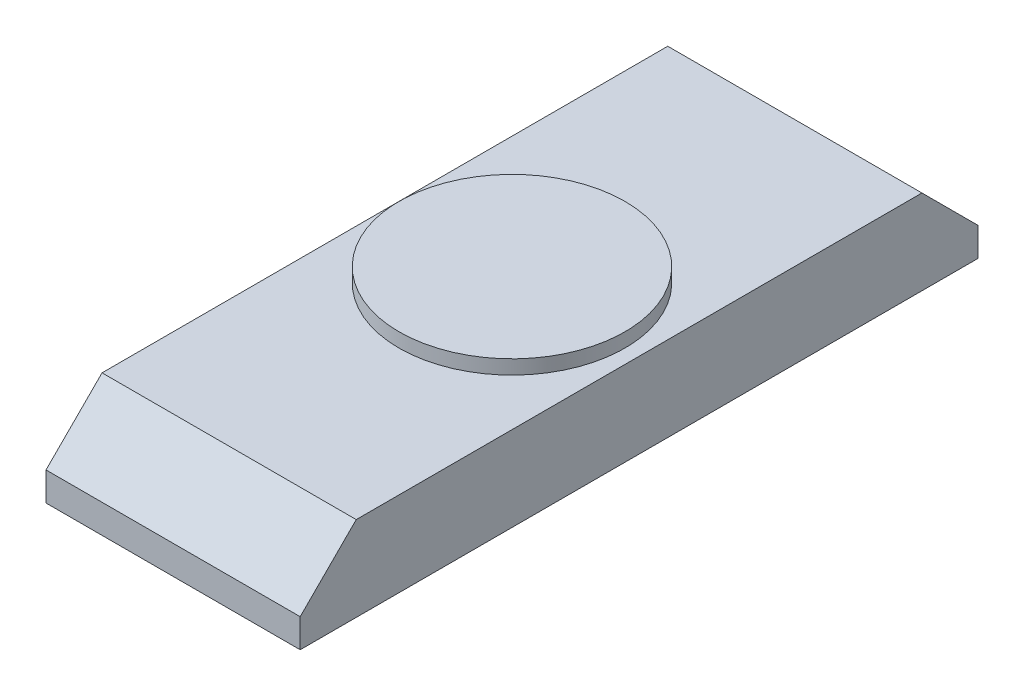
ISO-10303-21;
HEADER;
FILE_DESCRIPTION(('STEP AP214'),'2;1');
FILE_NAME('part.step','',(''),(''),'','','');
FILE_SCHEMA(('AUTOMOTIVE_DESIGN { 1 0 10303 214 1 1 1 1 }'));
ENDSEC;
DATA;
#1=APPLICATION_CONTEXT('core data for automotive mechanical design processes');
#2=APPLICATION_PROTOCOL_DEFINITION('international standard','automotive_design',2000,#1);
#3=PRODUCT_CONTEXT('',#1,'mechanical');
#4=PRODUCT('Part','Part','',(#3));
#5=PRODUCT_RELATED_PRODUCT_CATEGORY('part','',(#4));
#6=PRODUCT_DEFINITION_FORMATION('','',#4);
#7=PRODUCT_DEFINITION_CONTEXT('part definition',#1,'design');
#8=PRODUCT_DEFINITION('design','',#6,#7);
#9=PRODUCT_DEFINITION_SHAPE('','',#8);
#10=(LENGTH_UNIT() NAMED_UNIT(*) SI_UNIT(.MILLI.,.METRE.));
#11=(NAMED_UNIT(*) PLANE_ANGLE_UNIT() SI_UNIT($,.RADIAN.));
#12=(NAMED_UNIT(*) SI_UNIT($,.STERADIAN.) SOLID_ANGLE_UNIT());
#13=UNCERTAINTY_MEASURE_WITH_UNIT(LENGTH_MEASURE(1.E-05),#10,'distance_accuracy_value','');
#14=(GEOMETRIC_REPRESENTATION_CONTEXT(3) GLOBAL_UNCERTAINTY_ASSIGNED_CONTEXT((#13)) GLOBAL_UNIT_ASSIGNED_CONTEXT((#10,
#11,#12)) REPRESENTATION_CONTEXT('',''));
#15=CARTESIAN_POINT('',(0.,0.,0.));
#16=DIRECTION('',(0.,0.,1.));
#17=DIRECTION('',(1.,0.,0.));
#18=AXIS2_PLACEMENT_3D('',#15,#16,#17);
#19=CARTESIAN_POINT('',(0.,19.05,152.4));
#20=DIRECTION('',(0.,0.,-1.));
#21=DIRECTION('',(-1.,0.,0.));
#22=AXIS2_PLACEMENT_3D('',#19,#20,#21);
#23=PLANE('',#22);
#24=DIRECTION('',(1.,0.,0.));
#25=VECTOR('',#24,1.);
#26=CARTESIAN_POINT('',(0.,6.44716954746249,152.4));
#27=LINE('',#26,#25);
#28=CARTESIAN_POINT('',(0.,6.44716954746249,152.4));
#29=VERTEX_POINT('',#28);
#30=CARTESIAN_POINT('',(57.15,6.44716954746249,152.4));
#31=VERTEX_POINT('',#30);
#32=EDGE_CURVE('E94',#29,#31,#27,.T.);
#33=ORIENTED_EDGE('',*,*,#32,.F.);
#34=DIRECTION('',(0.,-1.,0.));
#35=VECTOR('',#34,1.);
#36=CARTESIAN_POINT('',(0.,19.05,152.4));
#37=LINE('',#36,#35);
#38=CARTESIAN_POINT('',(0.,0.,152.4));
#39=VERTEX_POINT('',#38);
#40=EDGE_CURVE('E43',#29,#39,#37,.T.);
#41=ORIENTED_EDGE('',*,*,#40,.T.);
#42=DIRECTION('',(1.,0.,0.));
#43=VECTOR('',#42,1.);
#44=CARTESIAN_POINT('',(0.,0.,152.4));
#45=LINE('',#44,#43);
#46=CARTESIAN_POINT('',(57.15,0.,152.4));
#47=VERTEX_POINT('',#46);
#48=EDGE_CURVE('E122',#39,#47,#45,.T.);
#49=ORIENTED_EDGE('',*,*,#48,.T.);
#50=DIRECTION('',(0.,-1.,0.));
#51=VECTOR('',#50,1.);
#52=CARTESIAN_POINT('',(57.15,19.05,152.4));
#53=LINE('',#52,#51);
#54=EDGE_CURVE('E104',#31,#47,#53,.T.);
#55=ORIENTED_EDGE('',*,*,#54,.F.);
#56=EDGE_LOOP('',(#33,#41,#49,#55));
#57=FACE_BOUND('',#56,.T.);
#58=ADVANCED_FACE('F39',(#57),#23,.F.);
#59=CARTESIAN_POINT('',(57.15,19.05,0.));
#60=DIRECTION('',(-1.,0.,0.));
#61=DIRECTION('',(0.,0.,1.));
#62=AXIS2_PLACEMENT_3D('',#59,#60,#61);
#63=PLANE('',#62);
#64=DIRECTION('',(0.,0.707106781186549,-0.707106781186546));
#65=VECTOR('',#64,1.);
#66=CARTESIAN_POINT('',(57.15,6.44716954746249,152.4));
#67=LINE('',#66,#65);
#68=CARTESIAN_POINT('',(57.15,19.05,139.797169547462));
#69=VERTEX_POINT('',#68);
#70=EDGE_CURVE('E54',#31,#69,#67,.T.);
#71=ORIENTED_EDGE('',*,*,#70,.F.);
#72=ORIENTED_EDGE('',*,*,#54,.T.);
#73=DIRECTION('',(0.,0.,-1.));
#74=VECTOR('',#73,1.);
#75=CARTESIAN_POINT('',(57.15,0.,0.));
#76=LINE('',#75,#74);
#77=CARTESIAN_POINT('',(57.15,0.,0.));
#78=VERTEX_POINT('',#77);
#79=EDGE_CURVE('E125',#47,#78,#76,.T.);
#80=ORIENTED_EDGE('',*,*,#79,.T.);
#81=DIRECTION('',(0.,-1.,0.));
#82=VECTOR('',#81,1.);
#83=CARTESIAN_POINT('',(57.15,19.05,0.));
#84=LINE('',#83,#82);
#85=CARTESIAN_POINT('',(57.15,6.44716954746249,0.));
#86=VERTEX_POINT('',#85);
#87=EDGE_CURVE('E109',#86,#78,#84,.T.);
#88=ORIENTED_EDGE('',*,*,#87,.F.);
#89=DIRECTION('',(0.,-0.707106781186542,-0.707106781186552));
#90=VECTOR('',#89,1.);
#91=CARTESIAN_POINT('',(57.15,6.44716954746249,0.));
#92=LINE('',#91,#90);
#93=CARTESIAN_POINT('',(57.15,19.05,12.6028304525377));
#94=VERTEX_POINT('',#93);
#95=EDGE_CURVE('E132',#94,#86,#92,.T.);
#96=ORIENTED_EDGE('',*,*,#95,.F.);
#97=DIRECTION('',(0.,0.,-1.));
#98=VECTOR('',#97,1.);
#99=CARTESIAN_POINT('',(57.15,19.05,0.));
#100=LINE('',#99,#98);
#101=EDGE_CURVE('E120',#69,#94,#100,.T.);
#102=ORIENTED_EDGE('',*,*,#101,.F.);
#103=EDGE_LOOP('',(#71,#72,#80,#88,#96,#102));
#104=FACE_BOUND('',#103,.T.);
#105=ADVANCED_FACE('F154',(#104),#63,.F.);
#106=CARTESIAN_POINT('',(0.,19.05,0.));
#107=DIRECTION('',(0.,1.,0.));
#108=DIRECTION('',(0.,0.,1.));
#109=AXIS2_PLACEMENT_3D('',#106,#107,#108);
#110=PLANE('',#109);
#111=CARTESIAN_POINT('',(28.575,19.05,76.2000000000001));
#112=DIRECTION('',(0.,1.,0.));
#113=DIRECTION('',(0.,0.,1.));
#114=AXIS2_PLACEMENT_3D('',#111,#112,#113);
#115=CIRCLE('',#114,25.4);
#116=CARTESIAN_POINT('',(28.575,19.05,101.6));
#117=VERTEX_POINT('',#116);
#118=EDGE_CURVE('E11',#117,#117,#115,.T.);
#119=ORIENTED_EDGE('',*,*,#118,.F.);
#120=EDGE_LOOP('',(#119));
#121=FACE_BOUND('',#120,.T.);
#122=DIRECTION('',(0.,0.,1.));
#123=VECTOR('',#122,1.);
#124=CARTESIAN_POINT('',(0.,19.05,0.));
#125=LINE('',#124,#123);
#126=CARTESIAN_POINT('',(0.,19.05,12.6028304525377));
#127=VERTEX_POINT('',#126);
#128=CARTESIAN_POINT('',(0.,19.05,139.797169547463));
#129=VERTEX_POINT('',#128);
#130=EDGE_CURVE('E123',#127,#129,#125,.T.);
#131=ORIENTED_EDGE('',*,*,#130,.T.);
#132=DIRECTION('',(1.,0.,0.));
#133=VECTOR('',#132,1.);
#134=CARTESIAN_POINT('',(0.,19.05,139.797169547463));
#135=LINE('',#134,#133);
#136=EDGE_CURVE('E92',#129,#69,#135,.T.);
#137=ORIENTED_EDGE('',*,*,#136,.T.);
#138=ORIENTED_EDGE('',*,*,#101,.T.);
#139=DIRECTION('',(1.,0.,0.));
#140=VECTOR('',#139,1.);
#141=CARTESIAN_POINT('',(0.,19.05,12.6028304525377));
#142=LINE('',#141,#140);
#143=EDGE_CURVE('E135',#127,#94,#142,.T.);
#144=ORIENTED_EDGE('',*,*,#143,.F.);
#145=EDGE_LOOP('',(#131,#137,#138,#144));
#146=FACE_BOUND('',#145,.T.);
#147=ADVANCED_FACE('F155',(#121,#146),#110,.T.);
#148=CARTESIAN_POINT('',(0.,19.05,0.));
#149=DIRECTION('',(1.,0.,0.));
#150=DIRECTION('',(0.,0.,-1.));
#151=AXIS2_PLACEMENT_3D('',#148,#149,#150);
#152=PLANE('',#151);
#153=ORIENTED_EDGE('',*,*,#40,.F.);
#154=DIRECTION('',(0.,0.707106781186549,-0.707106781186546));
#155=VECTOR('',#154,1.);
#156=CARTESIAN_POINT('',(0.,6.44716954746249,152.4));
#157=LINE('',#156,#155);
#158=EDGE_CURVE('E93',#29,#129,#157,.T.);
#159=ORIENTED_EDGE('',*,*,#158,.T.);
#160=ORIENTED_EDGE('',*,*,#130,.F.);
#161=DIRECTION('',(0.,-0.707106781186542,-0.707106781186552));
#162=VECTOR('',#161,1.);
#163=CARTESIAN_POINT('',(0.,6.44716954746249,0.));
#164=LINE('',#163,#162);
#165=CARTESIAN_POINT('',(0.,6.44716954746249,0.));
#166=VERTEX_POINT('',#165);
#167=EDGE_CURVE('E64',#127,#166,#164,.T.);
#168=ORIENTED_EDGE('',*,*,#167,.T.);
#169=DIRECTION('',(0.,-1.,0.));
#170=VECTOR('',#169,1.);
#171=CARTESIAN_POINT('',(0.,19.05,0.));
#172=LINE('',#171,#170);
#173=CARTESIAN_POINT('',(0.,0.,0.));
#174=VERTEX_POINT('',#173);
#175=EDGE_CURVE('E114',#166,#174,#172,.T.);
#176=ORIENTED_EDGE('',*,*,#175,.T.);
#177=DIRECTION('',(0.,0.,1.));
#178=VECTOR('',#177,1.);
#179=CARTESIAN_POINT('',(0.,0.,0.));
#180=LINE('',#179,#178);
#181=EDGE_CURVE('E108',#174,#39,#180,.T.);
#182=ORIENTED_EDGE('',*,*,#181,.T.);
#183=EDGE_LOOP('',(#153,#159,#160,#168,#176,#182));
#184=FACE_BOUND('',#183,.T.);
#185=ADVANCED_FACE('F41',(#184),#152,.F.);
#186=CARTESIAN_POINT('',(0.,19.05,0.));
#187=DIRECTION('',(0.,0.,1.));
#188=DIRECTION('',(1.,0.,0.));
#189=AXIS2_PLACEMENT_3D('',#186,#187,#188);
#190=PLANE('',#189);
#191=ORIENTED_EDGE('',*,*,#175,.F.);
#192=DIRECTION('',(1.,0.,0.));
#193=VECTOR('',#192,1.);
#194=CARTESIAN_POINT('',(0.,6.44716954746249,0.));
#195=LINE('',#194,#193);
#196=EDGE_CURVE('E131',#166,#86,#195,.T.);
#197=ORIENTED_EDGE('',*,*,#196,.T.);
#198=ORIENTED_EDGE('',*,*,#87,.T.);
#199=DIRECTION('',(-1.,0.,0.));
#200=VECTOR('',#199,1.);
#201=CARTESIAN_POINT('',(0.,0.,0.));
#202=LINE('',#201,#200);
#203=EDGE_CURVE('E119',#78,#174,#202,.T.);
#204=ORIENTED_EDGE('',*,*,#203,.T.);
#205=EDGE_LOOP('',(#191,#197,#198,#204));
#206=FACE_BOUND('',#205,.T.);
#207=ADVANCED_FACE('F159',(#206),#190,.F.);
#208=CARTESIAN_POINT('',(0.,0.,0.));
#209=DIRECTION('',(0.,1.,0.));
#210=DIRECTION('',(0.,0.,1.));
#211=AXIS2_PLACEMENT_3D('',#208,#209,#210);
#212=PLANE('',#211);
#213=ORIENTED_EDGE('',*,*,#181,.F.);
#214=ORIENTED_EDGE('',*,*,#203,.F.);
#215=ORIENTED_EDGE('',*,*,#79,.F.);
#216=ORIENTED_EDGE('',*,*,#48,.F.);
#217=EDGE_LOOP('',(#213,#214,#215,#216));
#218=FACE_BOUND('',#217,.T.);
#219=ADVANCED_FACE('F164',(#218),#212,.F.);
#220=CARTESIAN_POINT('',(0.,6.44716954746249,0.));
#221=DIRECTION('',(0.,-0.707106781186553,0.707106781186543));
#222=DIRECTION('',(0.,-0.707106781186543,-0.707106781186553));
#223=AXIS2_PLACEMENT_3D('',#220,#221,#222);
#224=PLANE('',#223);
#225=ORIENTED_EDGE('',*,*,#95,.T.);
#226=ORIENTED_EDGE('',*,*,#196,.F.);
#227=ORIENTED_EDGE('',*,*,#167,.F.);
#228=ORIENTED_EDGE('',*,*,#143,.T.);
#229=EDGE_LOOP('',(#225,#226,#227,#228));
#230=FACE_BOUND('',#229,.T.);
#231=ADVANCED_FACE('F170',(#230),#224,.F.);
#232=CARTESIAN_POINT('',(0.,6.44716954746249,152.4));
#233=DIRECTION('',(0.,-0.707106781186546,-0.707106781186549));
#234=DIRECTION('',(0.,0.707106781186549,-0.707106781186546));
#235=AXIS2_PLACEMENT_3D('',#232,#233,#234);
#236=PLANE('',#235);
#237=ORIENTED_EDGE('',*,*,#70,.T.);
#238=ORIENTED_EDGE('',*,*,#136,.F.);
#239=ORIENTED_EDGE('',*,*,#158,.F.);
#240=ORIENTED_EDGE('',*,*,#32,.T.);
#241=EDGE_LOOP('',(#237,#238,#239,#240));
#242=FACE_BOUND('',#241,.T.);
#243=ADVANCED_FACE('F91',(#242),#236,.F.);
#244=CARTESIAN_POINT('',(28.575,22.225,76.2000000000001));
#245=DIRECTION('',(0.,-1.,0.));
#246=DIRECTION('',(0.,0.,-1.));
#247=AXIS2_PLACEMENT_3D('',#244,#245,#246);
#248=CYLINDRICAL_SURFACE('',#247,25.4);
#249=CARTESIAN_POINT('',(28.575,22.225,76.2000000000001));
#250=DIRECTION('',(0.,1.,0.));
#251=DIRECTION('',(0.,0.,1.));
#252=AXIS2_PLACEMENT_3D('',#249,#250,#251);
#253=CIRCLE('',#252,25.4);
#254=CARTESIAN_POINT('',(28.575,22.225,101.6));
#255=VERTEX_POINT('',#254);
#256=EDGE_CURVE('E140',#255,#255,#253,.T.);
#257=ORIENTED_EDGE('',*,*,#256,.F.);
#258=EDGE_LOOP('',(#257));
#259=FACE_BOUND('',#258,.T.);
#260=ORIENTED_EDGE('',*,*,#118,.T.);
#261=EDGE_LOOP('',(#260));
#262=FACE_BOUND('',#261,.T.);
#263=ADVANCED_FACE('F148',(#259,#262),#248,.T.);
#264=CARTESIAN_POINT('',(0.,22.225,0.));
#265=DIRECTION('',(0.,1.,0.));
#266=DIRECTION('',(0.,0.,1.));
#267=AXIS2_PLACEMENT_3D('',#264,#265,#266);
#268=PLANE('',#267);
#269=ORIENTED_EDGE('',*,*,#256,.T.);
#270=EDGE_LOOP('',(#269));
#271=FACE_BOUND('',#270,.T.);
#272=ADVANCED_FACE('F145',(#271),#268,.T.);
#273=CLOSED_SHELL('',(#58,#105,#147,#185,#207,#219,#231,#243,#263,#272));
#274=MANIFOLD_SOLID_BREP('B2',#273);
#275=ADVANCED_BREP_SHAPE_REPRESENTATION('',(#18,#274),#14);
#276=SHAPE_DEFINITION_REPRESENTATION(#9,#275);
ENDSEC;
END-ISO-10303-21;
